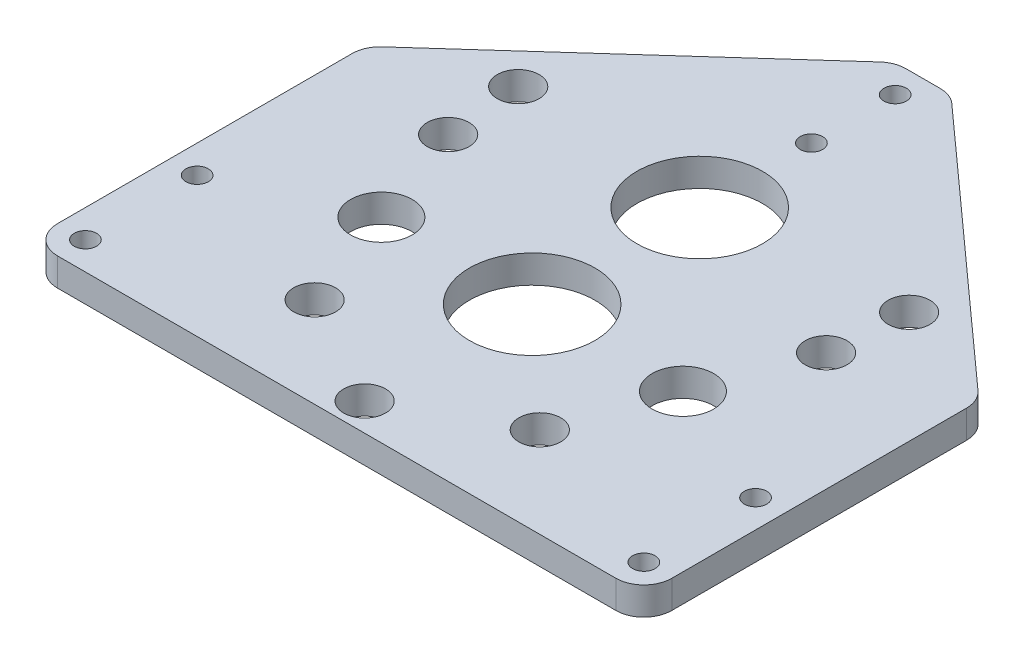
ISO-10303-21;
HEADER;
FILE_DESCRIPTION(('STEP AP214'),'2;1');
FILE_NAME('part.step','',(''),(''),'','','');
FILE_SCHEMA(('AUTOMOTIVE_DESIGN { 1 0 10303 214 1 1 1 1 }'));
ENDSEC;
DATA;
#1=APPLICATION_CONTEXT('core data for automotive mechanical design processes');
#2=APPLICATION_PROTOCOL_DEFINITION('international standard','automotive_design',2000,#1);
#3=PRODUCT_CONTEXT('',#1,'mechanical');
#4=PRODUCT('Part','Part','',(#3));
#5=PRODUCT_RELATED_PRODUCT_CATEGORY('part','',(#4));
#6=PRODUCT_DEFINITION_FORMATION('','',#4);
#7=PRODUCT_DEFINITION_CONTEXT('part definition',#1,'design');
#8=PRODUCT_DEFINITION('design','',#6,#7);
#9=PRODUCT_DEFINITION_SHAPE('','',#8);
#10=(LENGTH_UNIT() NAMED_UNIT(*) SI_UNIT(.MILLI.,.METRE.));
#11=(NAMED_UNIT(*) PLANE_ANGLE_UNIT() SI_UNIT($,.RADIAN.));
#12=(NAMED_UNIT(*) SI_UNIT($,.STERADIAN.) SOLID_ANGLE_UNIT());
#13=UNCERTAINTY_MEASURE_WITH_UNIT(LENGTH_MEASURE(1.E-05),#10,'distance_accuracy_value','');
#14=(GEOMETRIC_REPRESENTATION_CONTEXT(3) GLOBAL_UNCERTAINTY_ASSIGNED_CONTEXT((#13)) GLOBAL_UNIT_ASSIGNED_CONTEXT((#10,
#11,#12)) REPRESENTATION_CONTEXT('',''));
#15=CARTESIAN_POINT('',(0.,0.,0.));
#16=DIRECTION('',(0.,0.,1.));
#17=DIRECTION('',(1.,0.,0.));
#18=AXIS2_PLACEMENT_3D('',#15,#16,#17);
#19=CARTESIAN_POINT('',(-69.85,6.35,-57.15));
#20=DIRECTION('',(1.,0.,0.));
#21=DIRECTION('',(0.,0.,-1.));
#22=AXIS2_PLACEMENT_3D('',#19,#20,#21);
#23=PLANE('',#22);
#24=DIRECTION('',(0.,0.,1.));
#25=VECTOR('',#24,1.);
#26=CARTESIAN_POINT('',(-69.85,6.35,-57.15));
#27=LINE('',#26,#25);
#28=CARTESIAN_POINT('',(-69.85,6.35,-54.3219487301082));
#29=VERTEX_POINT('',#28);
#30=CARTESIAN_POINT('',(-69.85,6.35,12.7));
#31=VERTEX_POINT('',#30);
#32=EDGE_CURVE('E153',#29,#31,#27,.T.);
#33=ORIENTED_EDGE('',*,*,#32,.F.);
#34=DIRECTION('',(0.,-1.,0.));
#35=VECTOR('',#34,1.);
#36=CARTESIAN_POINT('',(-69.85,6.35,-54.3219487301082));
#37=LINE('',#36,#35);
#38=CARTESIAN_POINT('',(-69.85,0.,-54.3219487301082));
#39=VERTEX_POINT('',#38);
#40=EDGE_CURVE('E11',#29,#39,#37,.T.);
#41=ORIENTED_EDGE('',*,*,#40,.T.);
#42=DIRECTION('',(0.,0.,1.));
#43=VECTOR('',#42,1.);
#44=CARTESIAN_POINT('',(-69.85,0.,-57.15));
#45=LINE('',#44,#43);
#46=CARTESIAN_POINT('',(-69.85,0.,12.7));
#47=VERTEX_POINT('',#46);
#48=EDGE_CURVE('E301',#39,#47,#45,.T.);
#49=ORIENTED_EDGE('',*,*,#48,.T.);
#50=DIRECTION('',(0.,-1.,0.));
#51=VECTOR('',#50,1.);
#52=CARTESIAN_POINT('',(-69.85,6.35,12.7));
#53=LINE('',#52,#51);
#54=EDGE_CURVE('E42',#47,#31,#53,.F.);
#55=ORIENTED_EDGE('',*,*,#54,.T.);
#56=EDGE_LOOP('',(#33,#41,#49,#55));
#57=FACE_BOUND('',#56,.T.);
#58=ADVANCED_FACE('F33',(#57),#23,.F.);
#59=CARTESIAN_POINT('',(-69.85,6.35,19.05));
#60=DIRECTION('',(0.,0.,-1.));
#61=DIRECTION('',(-1.,0.,0.));
#62=AXIS2_PLACEMENT_3D('',#59,#60,#61);
#63=PLANE('',#62);
#64=DIRECTION('',(1.,0.,0.));
#65=VECTOR('',#64,1.);
#66=CARTESIAN_POINT('',(-69.85,0.,19.05));
#67=LINE('',#66,#65);
#68=CARTESIAN_POINT('',(-63.5,0.,19.05));
#69=VERTEX_POINT('',#68);
#70=CARTESIAN_POINT('',(63.5,0.,19.05));
#71=VERTEX_POINT('',#70);
#72=EDGE_CURVE('E316',#69,#71,#67,.T.);
#73=ORIENTED_EDGE('',*,*,#72,.T.);
#74=DIRECTION('',(0.,-1.,0.));
#75=VECTOR('',#74,1.);
#76=CARTESIAN_POINT('',(63.5,6.35,19.05));
#77=LINE('',#76,#75);
#78=CARTESIAN_POINT('',(63.5,6.35,19.05));
#79=VERTEX_POINT('',#78);
#80=EDGE_CURVE('E227',#71,#79,#77,.F.);
#81=ORIENTED_EDGE('',*,*,#80,.T.);
#82=DIRECTION('',(1.,0.,0.));
#83=VECTOR('',#82,1.);
#84=CARTESIAN_POINT('',(-69.85,6.35,19.05));
#85=LINE('',#84,#83);
#86=CARTESIAN_POINT('',(-63.5,6.35,19.05));
#87=VERTEX_POINT('',#86);
#88=EDGE_CURVE('E157',#87,#79,#85,.T.);
#89=ORIENTED_EDGE('',*,*,#88,.F.);
#90=DIRECTION('',(0.,-1.,0.));
#91=VECTOR('',#90,1.);
#92=CARTESIAN_POINT('',(-63.5,6.35,19.05));
#93=LINE('',#92,#91);
#94=EDGE_CURVE('E224',#87,#69,#93,.T.);
#95=ORIENTED_EDGE('',*,*,#94,.T.);
#96=EDGE_LOOP('',(#73,#81,#89,#95));
#97=FACE_BOUND('',#96,.T.);
#98=ADVANCED_FACE('F342',(#97),#63,.F.);
#99=CARTESIAN_POINT('',(69.85,6.35,19.05));
#100=DIRECTION('',(-1.,0.,0.));
#101=DIRECTION('',(0.,0.,1.));
#102=AXIS2_PLACEMENT_3D('',#99,#100,#101);
#103=PLANE('',#102);
#104=DIRECTION('',(0.,0.,-1.));
#105=VECTOR('',#104,1.);
#106=CARTESIAN_POINT('',(69.85,0.,19.05));
#107=LINE('',#106,#105);
#108=CARTESIAN_POINT('',(69.85,0.,12.7));
#109=VERTEX_POINT('',#108);
#110=CARTESIAN_POINT('',(69.85,0.,-54.3219487301082));
#111=VERTEX_POINT('',#110);
#112=EDGE_CURVE('E319',#109,#111,#107,.T.);
#113=ORIENTED_EDGE('',*,*,#112,.T.);
#114=DIRECTION('',(0.,-1.,0.));
#115=VECTOR('',#114,1.);
#116=CARTESIAN_POINT('',(69.85,6.35,-54.3219487301082));
#117=LINE('',#116,#115);
#118=CARTESIAN_POINT('',(69.85,6.35,-54.3219487301082));
#119=VERTEX_POINT('',#118);
#120=EDGE_CURVE('E222',#111,#119,#117,.F.);
#121=ORIENTED_EDGE('',*,*,#120,.T.);
#122=DIRECTION('',(0.,0.,-1.));
#123=VECTOR('',#122,1.);
#124=CARTESIAN_POINT('',(69.85,6.35,19.05));
#125=LINE('',#124,#123);
#126=CARTESIAN_POINT('',(69.85,6.35,12.7));
#127=VERTEX_POINT('',#126);
#128=EDGE_CURVE('E306',#127,#119,#125,.T.);
#129=ORIENTED_EDGE('',*,*,#128,.F.);
#130=DIRECTION('',(0.,-1.,0.));
#131=VECTOR('',#130,1.);
#132=CARTESIAN_POINT('',(69.85,6.35,12.7));
#133=LINE('',#132,#131);
#134=EDGE_CURVE('E219',#127,#109,#133,.T.);
#135=ORIENTED_EDGE('',*,*,#134,.T.);
#136=EDGE_LOOP('',(#113,#121,#129,#135));
#137=FACE_BOUND('',#136,.T.);
#138=ADVANCED_FACE('F339',(#137),#103,.F.);
#139=CARTESIAN_POINT('',(69.85,6.35,-57.15));
#140=DIRECTION('',(-0.66896473162245,0.,0.743294146247166));
#141=DIRECTION('',(0.743294146247166,0.,0.66896473162245));
#142=AXIS2_PLACEMENT_3D('',#139,#140,#141);
#143=PLANE('',#142);
#144=DIRECTION('',(-0.743294146247166,0.,-0.66896473162245));
#145=VECTOR('',#144,1.);
#146=CARTESIAN_POINT('',(69.85,0.,-57.15));
#147=LINE('',#146,#145);
#148=CARTESIAN_POINT('',(67.7479260458025,0.,-59.0418665587777));
#149=VERTEX_POINT('',#148);
#150=CARTESIAN_POINT('',(8.16120241258942,0.,-112.669917828669));
#151=VERTEX_POINT('',#150);
#152=EDGE_CURVE('E159',#149,#151,#147,.T.);
#153=ORIENTED_EDGE('',*,*,#152,.T.);
#154=DIRECTION('',(0.,-1.,0.));
#155=VECTOR('',#154,1.);
#156=CARTESIAN_POINT('',(8.16120241258941,6.35,-112.669917828669));
#157=LINE('',#156,#155);
#158=CARTESIAN_POINT('',(8.16120241258942,6.35,-112.669917828669));
#159=VERTEX_POINT('',#158);
#160=EDGE_CURVE('E50',#151,#159,#157,.F.);
#161=ORIENTED_EDGE('',*,*,#160,.T.);
#162=DIRECTION('',(-0.743294146247166,0.,-0.66896473162245));
#163=VECTOR('',#162,1.);
#164=CARTESIAN_POINT('',(69.85,6.35,-57.15));
#165=LINE('',#164,#163);
#166=CARTESIAN_POINT('',(67.7479260458025,6.35,-59.0418665587777));
#167=VERTEX_POINT('',#166);
#168=EDGE_CURVE('E308',#167,#159,#165,.T.);
#169=ORIENTED_EDGE('',*,*,#168,.F.);
#170=DIRECTION('',(0.,-1.,0.));
#171=VECTOR('',#170,1.);
#172=CARTESIAN_POINT('',(67.7479260458025,6.35,-59.0418665587777));
#173=LINE('',#172,#171);
#174=EDGE_CURVE('E215',#167,#149,#173,.T.);
#175=ORIENTED_EDGE('',*,*,#174,.T.);
#176=EDGE_LOOP('',(#153,#161,#169,#175));
#177=FACE_BOUND('',#176,.T.);
#178=ADVANCED_FACE('F322',(#177),#143,.F.);
#179=CARTESIAN_POINT('',(6.34999999999999,6.35,-114.3));
#180=DIRECTION('',(0.,0.,1.));
#181=DIRECTION('',(1.,0.,0.));
#182=AXIS2_PLACEMENT_3D('',#179,#180,#181);
#183=PLANE('',#182);
#184=DIRECTION('',(-1.,0.,0.));
#185=VECTOR('',#184,1.);
#186=CARTESIAN_POINT('',(6.34999999999999,0.,-114.3));
#187=LINE('',#186,#185);
#188=CARTESIAN_POINT('',(3.91327636678685,0.,-114.3));
#189=VERTEX_POINT('',#188);
#190=CARTESIAN_POINT('',(-3.91327636678688,0.,-114.3));
#191=VERTEX_POINT('',#190);
#192=EDGE_CURVE('E154',#189,#191,#187,.T.);
#193=ORIENTED_EDGE('',*,*,#192,.T.);
#194=DIRECTION('',(0.,-1.,0.));
#195=VECTOR('',#194,1.);
#196=CARTESIAN_POINT('',(-3.91327636678688,6.35,-114.3));
#197=LINE('',#196,#195);
#198=CARTESIAN_POINT('',(-3.91327636678688,6.35,-114.3));
#199=VERTEX_POINT('',#198);
#200=EDGE_CURVE('E131',#191,#199,#197,.F.);
#201=ORIENTED_EDGE('',*,*,#200,.T.);
#202=DIRECTION('',(-1.,0.,0.));
#203=VECTOR('',#202,1.);
#204=CARTESIAN_POINT('',(6.34999999999999,6.35,-114.3));
#205=LINE('',#204,#203);
#206=CARTESIAN_POINT('',(3.91327636678685,6.35,-114.3));
#207=VERTEX_POINT('',#206);
#208=EDGE_CURVE('E310',#207,#199,#205,.T.);
#209=ORIENTED_EDGE('',*,*,#208,.F.);
#210=DIRECTION('',(0.,-1.,0.));
#211=VECTOR('',#210,1.);
#212=CARTESIAN_POINT('',(3.91327636678685,6.35,-114.3));
#213=LINE('',#212,#211);
#214=EDGE_CURVE('E136',#207,#189,#213,.T.);
#215=ORIENTED_EDGE('',*,*,#214,.T.);
#216=EDGE_LOOP('',(#193,#201,#209,#215));
#217=FACE_BOUND('',#216,.T.);
#218=ADVANCED_FACE('F331',(#217),#183,.F.);
#219=CARTESIAN_POINT('',(-6.35000000000001,6.35,-114.3));
#220=DIRECTION('',(0.66896473162245,0.,0.743294146247166));
#221=DIRECTION('',(0.743294146247166,0.,-0.66896473162245));
#222=AXIS2_PLACEMENT_3D('',#219,#220,#221);
#223=PLANE('',#222);
#224=DIRECTION('',(-0.743294146247166,0.,0.66896473162245));
#225=VECTOR('',#224,1.);
#226=CARTESIAN_POINT('',(-6.35000000000001,6.35,-114.3));
#227=LINE('',#226,#225);
#228=CARTESIAN_POINT('',(-8.16120241258944,6.35,-112.66991782867));
#229=VERTEX_POINT('',#228);
#230=CARTESIAN_POINT('',(-67.7479260458025,6.35,-59.0418665587777));
#231=VERTEX_POINT('',#230);
#232=EDGE_CURVE('E146',#229,#231,#227,.T.);
#233=ORIENTED_EDGE('',*,*,#232,.F.);
#234=DIRECTION('',(0.,-1.,0.));
#235=VECTOR('',#234,1.);
#236=CARTESIAN_POINT('',(-8.16120241258944,6.35,-112.66991782867));
#237=LINE('',#236,#235);
#238=CARTESIAN_POINT('',(-8.16120241258944,0.,-112.66991782867));
#239=VERTEX_POINT('',#238);
#240=EDGE_CURVE('E130',#229,#239,#237,.T.);
#241=ORIENTED_EDGE('',*,*,#240,.T.);
#242=DIRECTION('',(-0.743294146247166,0.,0.66896473162245));
#243=VECTOR('',#242,1.);
#244=CARTESIAN_POINT('',(-6.35000000000001,0.,-114.3));
#245=LINE('',#244,#243);
#246=CARTESIAN_POINT('',(-67.7479260458025,0.,-59.0418665587777));
#247=VERTEX_POINT('',#246);
#248=EDGE_CURVE('E143',#239,#247,#245,.T.);
#249=ORIENTED_EDGE('',*,*,#248,.T.);
#250=DIRECTION('',(0.,-1.,0.));
#251=VECTOR('',#250,1.);
#252=CARTESIAN_POINT('',(-67.7479260458026,6.35,-59.0418665587777));
#253=LINE('',#252,#251);
#254=EDGE_CURVE('E148',#247,#231,#253,.F.);
#255=ORIENTED_EDGE('',*,*,#254,.T.);
#256=EDGE_LOOP('',(#233,#241,#249,#255));
#257=FACE_BOUND('',#256,.T.);
#258=ADVANCED_FACE('F142',(#257),#223,.F.);
#259=CARTESIAN_POINT('',(0.,6.35,0.));
#260=DIRECTION('',(0.,1.,0.));
#261=DIRECTION('',(0.,0.,1.));
#262=AXIS2_PLACEMENT_3D('',#259,#260,#261);
#263=PLANE('',#262);
#264=CARTESIAN_POINT('',(-44.45,6.35,-66.675));
#265=DIRECTION('',(0.,1.,0.));
#266=DIRECTION('',(0.,0.,1.));
#267=AXIS2_PLACEMENT_3D('',#264,#265,#266);
#268=CIRCLE('',#267,4.76249999999999);
#269=CARTESIAN_POINT('',(-44.45,6.35,-61.9125));
#270=VERTEX_POINT('',#269);
#271=EDGE_CURVE('E232',#270,#270,#268,.T.);
#272=ORIENTED_EDGE('',*,*,#271,.F.);
#273=EDGE_LOOP('',(#272));
#274=FACE_BOUND('',#273,.T.);
#275=CARTESIAN_POINT('',(0.,6.35,12.7));
#276=DIRECTION('',(0.,1.,0.));
#277=DIRECTION('',(0.,0.,1.));
#278=AXIS2_PLACEMENT_3D('',#275,#276,#277);
#279=CIRCLE('',#278,4.7625);
#280=CARTESIAN_POINT('',(0.,6.35,17.4625));
#281=VERTEX_POINT('',#280);
#282=EDGE_CURVE('E235',#281,#281,#279,.T.);
#283=ORIENTED_EDGE('',*,*,#282,.F.);
#284=EDGE_LOOP('',(#283));
#285=FACE_BOUND('',#284,.T.);
#286=CARTESIAN_POINT('',(44.45,6.35,-66.675));
#287=DIRECTION('',(0.,1.,0.));
#288=DIRECTION('',(0.,0.,1.));
#289=AXIS2_PLACEMENT_3D('',#286,#287,#288);
#290=CIRCLE('',#289,4.7625);
#291=CARTESIAN_POINT('',(44.45,6.35,-61.9125));
#292=VERTEX_POINT('',#291);
#293=EDGE_CURVE('E192',#292,#292,#290,.T.);
#294=ORIENTED_EDGE('',*,*,#293,.F.);
#295=EDGE_LOOP('',(#294));
#296=FACE_BOUND('',#295,.T.);
#297=CARTESIAN_POINT('',(-63.4999999999999,6.35,-12.7));
#298=DIRECTION('',(0.,1.,0.));
#299=DIRECTION('',(0.,0.,1.));
#300=AXIS2_PLACEMENT_3D('',#297,#298,#299);
#301=CIRCLE('',#300,2.55269999999998);
#302=CARTESIAN_POINT('',(-63.4999999999999,6.35,-10.1473));
#303=VERTEX_POINT('',#302);
#304=EDGE_CURVE('E188',#303,#303,#301,.T.);
#305=ORIENTED_EDGE('',*,*,#304,.F.);
#306=EDGE_LOOP('',(#305));
#307=FACE_BOUND('',#306,.T.);
#308=CARTESIAN_POINT('',(63.5000000000002,6.35,-12.7));
#309=DIRECTION('',(0.,1.,0.));
#310=DIRECTION('',(0.,0.,1.));
#311=AXIS2_PLACEMENT_3D('',#308,#309,#310);
#312=CIRCLE('',#311,2.55269999999998);
#313=CARTESIAN_POINT('',(63.5000000000002,6.35,-10.1473));
#314=VERTEX_POINT('',#313);
#315=EDGE_CURVE('E184',#314,#314,#312,.T.);
#316=ORIENTED_EDGE('',*,*,#315,.F.);
#317=EDGE_LOOP('',(#316));
#318=FACE_BOUND('',#317,.T.);
#319=CARTESIAN_POINT('',(0.,6.35,-107.95));
#320=DIRECTION('',(0.,1.,0.));
#321=DIRECTION('',(0.,0.,1.));
#322=AXIS2_PLACEMENT_3D('',#319,#320,#321);
#323=CIRCLE('',#322,2.55269999999998);
#324=CARTESIAN_POINT('',(0.,6.35,-105.3973));
#325=VERTEX_POINT('',#324);
#326=EDGE_CURVE('E183',#325,#325,#323,.T.);
#327=ORIENTED_EDGE('',*,*,#326,.F.);
#328=EDGE_LOOP('',(#327));
#329=FACE_BOUND('',#328,.T.);
#330=CARTESIAN_POINT('',(-63.5,6.35,12.7));
#331=DIRECTION('',(0.,1.,0.));
#332=DIRECTION('',(0.,0.,1.));
#333=AXIS2_PLACEMENT_3D('',#330,#331,#332);
#334=CIRCLE('',#333,2.5527);
#335=CARTESIAN_POINT('',(-63.5,6.35,15.2527));
#336=VERTEX_POINT('',#335);
#337=EDGE_CURVE('E254',#336,#336,#334,.T.);
#338=ORIENTED_EDGE('',*,*,#337,.F.);
#339=EDGE_LOOP('',(#338));
#340=FACE_BOUND('',#339,.T.);
#341=CARTESIAN_POINT('',(63.5000000000002,6.35,12.7));
#342=DIRECTION('',(0.,1.,0.));
#343=DIRECTION('',(0.,0.,1.));
#344=AXIS2_PLACEMENT_3D('',#341,#342,#343);
#345=CIRCLE('',#344,2.55270000000001);
#346=CARTESIAN_POINT('',(63.5000000000002,6.35,15.2527));
#347=VERTEX_POINT('',#346);
#348=EDGE_CURVE('E260',#347,#347,#345,.T.);
#349=ORIENTED_EDGE('',*,*,#348,.F.);
#350=EDGE_LOOP('',(#349));
#351=FACE_BOUND('',#350,.T.);
#352=CARTESIAN_POINT('',(0.,6.35,-88.9));
#353=DIRECTION('',(0.,1.,0.));
#354=DIRECTION('',(0.,0.,1.));
#355=AXIS2_PLACEMENT_3D('',#352,#353,#354);
#356=CIRCLE('',#355,2.5527);
#357=CARTESIAN_POINT('',(0.,6.35,-86.3473));
#358=VERTEX_POINT('',#357);
#359=EDGE_CURVE('E266',#358,#358,#356,.T.);
#360=ORIENTED_EDGE('',*,*,#359,.F.);
#361=EDGE_LOOP('',(#360));
#362=FACE_BOUND('',#361,.T.);
#363=CARTESIAN_POINT('',(-25.602688359528,6.35,-1.53180743203793));
#364=DIRECTION('',(0.,1.,0.));
#365=DIRECTION('',(0.,0.,1.));
#366=AXIS2_PLACEMENT_3D('',#363,#364,#365);
#367=CIRCLE('',#366,4.76250000000001);
#368=CARTESIAN_POINT('',(-25.602688359528,6.35,3.23069256796208));
#369=VERTEX_POINT('',#368);
#370=EDGE_CURVE('E167',#369,#369,#367,.T.);
#371=ORIENTED_EDGE('',*,*,#370,.F.);
#372=EDGE_LOOP('',(#371));
#373=FACE_BOUND('',#372,.T.);
#374=CARTESIAN_POINT('',(25.6026883595283,6.35,-1.53180743203786));
#375=DIRECTION('',(0.,1.,0.));
#376=DIRECTION('',(0.,0.,1.));
#377=AXIS2_PLACEMENT_3D('',#374,#375,#376);
#378=CIRCLE('',#377,4.76250000000001);
#379=CARTESIAN_POINT('',(25.6026883595283,6.35,3.23069256796215));
#380=VERTEX_POINT('',#379);
#381=EDGE_CURVE('E176',#380,#380,#378,.T.);
#382=ORIENTED_EDGE('',*,*,#381,.F.);
#383=EDGE_LOOP('',(#382));
#384=FACE_BOUND('',#383,.T.);
#385=CARTESIAN_POINT('',(42.977311640472,6.35,-49.2681925679621));
#386=DIRECTION('',(0.,1.,0.));
#387=DIRECTION('',(0.,0.,1.));
#388=AXIS2_PLACEMENT_3D('',#385,#386,#387);
#389=CIRCLE('',#388,4.76250000000001);
#390=CARTESIAN_POINT('',(42.977311640472,6.35,-44.5056925679621));
#391=VERTEX_POINT('',#390);
#392=EDGE_CURVE('E171',#391,#391,#389,.T.);
#393=ORIENTED_EDGE('',*,*,#392,.F.);
#394=EDGE_LOOP('',(#393));
#395=FACE_BOUND('',#394,.T.);
#396=CARTESIAN_POINT('',(-42.9773116404716,6.35,-49.2681925679622));
#397=DIRECTION('',(0.,1.,0.));
#398=DIRECTION('',(0.,0.,1.));
#399=AXIS2_PLACEMENT_3D('',#396,#397,#398);
#400=CIRCLE('',#399,4.76250000000001);
#401=CARTESIAN_POINT('',(-42.9773116404716,6.35,-44.5056925679622));
#402=VERTEX_POINT('',#401);
#403=EDGE_CURVE('E166',#402,#402,#400,.T.);
#404=ORIENTED_EDGE('',*,*,#403,.F.);
#405=EDGE_LOOP('',(#404));
#406=FACE_BOUND('',#405,.T.);
#407=CARTESIAN_POINT('',(0.,6.35,-63.5));
#408=DIRECTION('',(0.,1.,0.));
#409=DIRECTION('',(0.,0.,1.));
#410=AXIS2_PLACEMENT_3D('',#407,#408,#409);
#411=CIRCLE('',#410,14.2875);
#412=CARTESIAN_POINT('',(0.,6.35,-49.2125));
#413=VERTEX_POINT('',#412);
#414=EDGE_CURVE('E279',#413,#413,#411,.T.);
#415=ORIENTED_EDGE('',*,*,#414,.F.);
#416=EDGE_LOOP('',(#415));
#417=FACE_BOUND('',#416,.T.);
#418=CARTESIAN_POINT('',(0.,6.35,-25.4));
#419=DIRECTION('',(0.,1.,0.));
#420=DIRECTION('',(0.,0.,1.));
#421=AXIS2_PLACEMENT_3D('',#418,#419,#420);
#422=CIRCLE('',#421,14.2875);
#423=CARTESIAN_POINT('',(0.,6.35,-11.1125));
#424=VERTEX_POINT('',#423);
#425=EDGE_CURVE('E283',#424,#424,#422,.T.);
#426=ORIENTED_EDGE('',*,*,#425,.F.);
#427=EDGE_LOOP('',(#426));
#428=FACE_BOUND('',#427,.T.);
#429=CARTESIAN_POINT('',(34.29,6.35,-25.4));
#430=DIRECTION('',(0.,1.,0.));
#431=DIRECTION('',(0.,0.,1.));
#432=AXIS2_PLACEMENT_3D('',#429,#430,#431);
#433=CIRCLE('',#432,7.);
#434=CARTESIAN_POINT('',(34.29,6.35,-18.4));
#435=VERTEX_POINT('',#434);
#436=EDGE_CURVE('E289',#435,#435,#433,.T.);
#437=ORIENTED_EDGE('',*,*,#436,.F.);
#438=EDGE_LOOP('',(#437));
#439=FACE_BOUND('',#438,.T.);
#440=CARTESIAN_POINT('',(-34.29,6.35,-25.4));
#441=DIRECTION('',(0.,1.,0.));
#442=DIRECTION('',(0.,0.,1.));
#443=AXIS2_PLACEMENT_3D('',#440,#441,#442);
#444=CIRCLE('',#443,7.);
#445=CARTESIAN_POINT('',(-34.29,6.35,-18.4));
#446=VERTEX_POINT('',#445);
#447=EDGE_CURVE('E295',#446,#446,#444,.T.);
#448=ORIENTED_EDGE('',*,*,#447,.F.);
#449=EDGE_LOOP('',(#448));
#450=FACE_BOUND('',#449,.T.);
#451=ORIENTED_EDGE('',*,*,#208,.T.);
#452=CARTESIAN_POINT('',(-3.91327636678688,6.35,-107.95));
#453=DIRECTION('',(0.,1.,0.));
#454=DIRECTION('',(0.,0.,1.));
#455=AXIS2_PLACEMENT_3D('',#452,#453,#454);
#456=CIRCLE('',#455,6.35);
#457=EDGE_CURVE('E213',#199,#229,#456,.T.);
#458=ORIENTED_EDGE('',*,*,#457,.T.);
#459=ORIENTED_EDGE('',*,*,#232,.T.);
#460=CARTESIAN_POINT('',(-63.5,6.35,-54.3219487301082));
#461=DIRECTION('',(0.,1.,0.));
#462=DIRECTION('',(0.,0.,1.));
#463=AXIS2_PLACEMENT_3D('',#460,#461,#462);
#464=CIRCLE('',#463,6.35);
#465=EDGE_CURVE('E206',#231,#29,#464,.T.);
#466=ORIENTED_EDGE('',*,*,#465,.T.);
#467=ORIENTED_EDGE('',*,*,#32,.T.);
#468=CARTESIAN_POINT('',(-63.5,6.35,12.7));
#469=DIRECTION('',(0.,1.,0.));
#470=DIRECTION('',(0.,0.,1.));
#471=AXIS2_PLACEMENT_3D('',#468,#469,#470);
#472=CIRCLE('',#471,6.35);
#473=EDGE_CURVE('E204',#31,#87,#472,.T.);
#474=ORIENTED_EDGE('',*,*,#473,.T.);
#475=ORIENTED_EDGE('',*,*,#88,.T.);
#476=CARTESIAN_POINT('',(63.5,6.35,12.7));
#477=DIRECTION('',(0.,1.,0.));
#478=DIRECTION('',(0.,0.,1.));
#479=AXIS2_PLACEMENT_3D('',#476,#477,#478);
#480=CIRCLE('',#479,6.35);
#481=EDGE_CURVE('E208',#79,#127,#480,.T.);
#482=ORIENTED_EDGE('',*,*,#481,.T.);
#483=ORIENTED_EDGE('',*,*,#128,.T.);
#484=CARTESIAN_POINT('',(63.5,6.35,-54.3219487301082));
#485=DIRECTION('',(0.,1.,0.));
#486=DIRECTION('',(0.,0.,1.));
#487=AXIS2_PLACEMENT_3D('',#484,#485,#486);
#488=CIRCLE('',#487,6.35);
#489=EDGE_CURVE('E57',#119,#167,#488,.T.);
#490=ORIENTED_EDGE('',*,*,#489,.T.);
#491=ORIENTED_EDGE('',*,*,#168,.T.);
#492=CARTESIAN_POINT('',(3.91327636678685,6.35,-107.95));
#493=DIRECTION('',(0.,1.,0.));
#494=DIRECTION('',(0.,0.,1.));
#495=AXIS2_PLACEMENT_3D('',#492,#493,#494);
#496=CIRCLE('',#495,6.35);
#497=EDGE_CURVE('E211',#159,#207,#496,.T.);
#498=ORIENTED_EDGE('',*,*,#497,.T.);
#499=EDGE_LOOP('',(#451,#458,#459,#466,#467,#474,#475,#482,#483,#490,#491,#498));
#500=FACE_BOUND('',#499,.T.);
#501=ADVANCED_FACE('F329',(#274,#285,#296,#307,#318,#329,#340,#351,#362,#373,#384,#395,#406,
#417,#428,#439,#450,#500),#263,.T.);
#502=CARTESIAN_POINT('',(0.,0.,0.));
#503=DIRECTION('',(0.,1.,0.));
#504=DIRECTION('',(0.,0.,1.));
#505=AXIS2_PLACEMENT_3D('',#502,#503,#504);
#506=PLANE('',#505);
#507=CARTESIAN_POINT('',(-44.45,0.,-66.675));
#508=DIRECTION('',(0.,1.,0.));
#509=DIRECTION('',(0.,0.,1.));
#510=AXIS2_PLACEMENT_3D('',#507,#508,#509);
#511=CIRCLE('',#510,4.76249999999999);
#512=CARTESIAN_POINT('',(-44.45,0.,-61.9125));
#513=VERTEX_POINT('',#512);
#514=EDGE_CURVE('E37',#513,#513,#511,.T.);
#515=ORIENTED_EDGE('',*,*,#514,.T.);
#516=EDGE_LOOP('',(#515));
#517=FACE_BOUND('',#516,.T.);
#518=CARTESIAN_POINT('',(0.,0.,12.7));
#519=DIRECTION('',(0.,1.,0.));
#520=DIRECTION('',(0.,0.,1.));
#521=AXIS2_PLACEMENT_3D('',#518,#519,#520);
#522=CIRCLE('',#521,4.7625);
#523=CARTESIAN_POINT('',(0.,0.,17.4625));
#524=VERTEX_POINT('',#523);
#525=EDGE_CURVE('E233',#524,#524,#522,.T.);
#526=ORIENTED_EDGE('',*,*,#525,.T.);
#527=EDGE_LOOP('',(#526));
#528=FACE_BOUND('',#527,.T.);
#529=CARTESIAN_POINT('',(44.45,0.,-66.675));
#530=DIRECTION('',(0.,1.,0.));
#531=DIRECTION('',(0.,0.,1.));
#532=AXIS2_PLACEMENT_3D('',#529,#530,#531);
#533=CIRCLE('',#532,4.7625);
#534=CARTESIAN_POINT('',(44.45,0.,-61.9125));
#535=VERTEX_POINT('',#534);
#536=EDGE_CURVE('E230',#535,#535,#533,.T.);
#537=ORIENTED_EDGE('',*,*,#536,.T.);
#538=EDGE_LOOP('',(#537));
#539=FACE_BOUND('',#538,.T.);
#540=CARTESIAN_POINT('',(-63.4999999999999,0.,-12.7));
#541=DIRECTION('',(0.,1.,0.));
#542=DIRECTION('',(0.,0.,1.));
#543=AXIS2_PLACEMENT_3D('',#540,#541,#542);
#544=CIRCLE('',#543,2.55269999999998);
#545=CARTESIAN_POINT('',(-63.4999999999999,0.,-10.1473));
#546=VERTEX_POINT('',#545);
#547=EDGE_CURVE('E189',#546,#546,#544,.T.);
#548=ORIENTED_EDGE('',*,*,#547,.T.);
#549=EDGE_LOOP('',(#548));
#550=FACE_BOUND('',#549,.T.);
#551=CARTESIAN_POINT('',(63.5000000000002,0.,-12.7));
#552=DIRECTION('',(0.,1.,0.));
#553=DIRECTION('',(0.,0.,1.));
#554=AXIS2_PLACEMENT_3D('',#551,#552,#553);
#555=CIRCLE('',#554,2.55269999999998);
#556=CARTESIAN_POINT('',(63.5000000000002,0.,-10.1473));
#557=VERTEX_POINT('',#556);
#558=EDGE_CURVE('E185',#557,#557,#555,.T.);
#559=ORIENTED_EDGE('',*,*,#558,.T.);
#560=EDGE_LOOP('',(#559));
#561=FACE_BOUND('',#560,.T.);
#562=CARTESIAN_POINT('',(0.,0.,-107.95));
#563=DIRECTION('',(0.,1.,0.));
#564=DIRECTION('',(0.,0.,1.));
#565=AXIS2_PLACEMENT_3D('',#562,#563,#564);
#566=CIRCLE('',#565,2.55269999999998);
#567=CARTESIAN_POINT('',(0.,0.,-105.3973));
#568=VERTEX_POINT('',#567);
#569=EDGE_CURVE('E180',#568,#568,#566,.T.);
#570=ORIENTED_EDGE('',*,*,#569,.T.);
#571=EDGE_LOOP('',(#570));
#572=FACE_BOUND('',#571,.T.);
#573=CARTESIAN_POINT('',(-63.5,0.,12.7));
#574=DIRECTION('',(0.,1.,0.));
#575=DIRECTION('',(0.,0.,1.));
#576=AXIS2_PLACEMENT_3D('',#573,#574,#575);
#577=CIRCLE('',#576,2.55269999999998);
#578=CARTESIAN_POINT('',(-63.5,0.,15.2527));
#579=VERTEX_POINT('',#578);
#580=EDGE_CURVE('E257',#579,#579,#577,.T.);
#581=ORIENTED_EDGE('',*,*,#580,.T.);
#582=EDGE_LOOP('',(#581));
#583=FACE_BOUND('',#582,.T.);
#584=CARTESIAN_POINT('',(63.5000000000002,0.,12.7));
#585=DIRECTION('',(0.,1.,0.));
#586=DIRECTION('',(0.,0.,1.));
#587=AXIS2_PLACEMENT_3D('',#584,#585,#586);
#588=CIRCLE('',#587,2.55269999999998);
#589=CARTESIAN_POINT('',(63.5000000000002,0.,15.2527));
#590=VERTEX_POINT('',#589);
#591=EDGE_CURVE('E263',#590,#590,#588,.T.);
#592=ORIENTED_EDGE('',*,*,#591,.T.);
#593=EDGE_LOOP('',(#592));
#594=FACE_BOUND('',#593,.T.);
#595=CARTESIAN_POINT('',(0.,0.,-88.9));
#596=DIRECTION('',(0.,1.,0.));
#597=DIRECTION('',(0.,0.,1.));
#598=AXIS2_PLACEMENT_3D('',#595,#596,#597);
#599=CIRCLE('',#598,2.55269999999998);
#600=CARTESIAN_POINT('',(0.,0.,-86.3473));
#601=VERTEX_POINT('',#600);
#602=EDGE_CURVE('E172',#601,#601,#599,.T.);
#603=ORIENTED_EDGE('',*,*,#602,.T.);
#604=EDGE_LOOP('',(#603));
#605=FACE_BOUND('',#604,.T.);
#606=CARTESIAN_POINT('',(-25.602688359528,0.,-1.53180743203793));
#607=DIRECTION('',(0.,1.,0.));
#608=DIRECTION('',(0.,0.,1.));
#609=AXIS2_PLACEMENT_3D('',#606,#607,#608);
#610=CIRCLE('',#609,4.76250000000001);
#611=CARTESIAN_POINT('',(-25.602688359528,0.,3.23069256796208));
#612=VERTEX_POINT('',#611);
#613=EDGE_CURVE('E177',#612,#612,#610,.T.);
#614=ORIENTED_EDGE('',*,*,#613,.T.);
#615=EDGE_LOOP('',(#614));
#616=FACE_BOUND('',#615,.T.);
#617=CARTESIAN_POINT('',(25.6026883595283,0.,-1.53180743203786));
#618=DIRECTION('',(0.,1.,0.));
#619=DIRECTION('',(0.,0.,1.));
#620=AXIS2_PLACEMENT_3D('',#617,#618,#619);
#621=CIRCLE('',#620,4.76250000000001);
#622=CARTESIAN_POINT('',(25.6026883595283,0.,3.23069256796215));
#623=VERTEX_POINT('',#622);
#624=EDGE_CURVE('E173',#623,#623,#621,.T.);
#625=ORIENTED_EDGE('',*,*,#624,.T.);
#626=EDGE_LOOP('',(#625));
#627=FACE_BOUND('',#626,.T.);
#628=CARTESIAN_POINT('',(42.977311640472,0.,-49.2681925679621));
#629=DIRECTION('',(0.,1.,0.));
#630=DIRECTION('',(0.,0.,1.));
#631=AXIS2_PLACEMENT_3D('',#628,#629,#630);
#632=CIRCLE('',#631,4.76250000000001);
#633=CARTESIAN_POINT('',(42.977311640472,0.,-44.5056925679621));
#634=VERTEX_POINT('',#633);
#635=EDGE_CURVE('E168',#634,#634,#632,.T.);
#636=ORIENTED_EDGE('',*,*,#635,.T.);
#637=EDGE_LOOP('',(#636));
#638=FACE_BOUND('',#637,.T.);
#639=CARTESIAN_POINT('',(-42.9773116404716,0.,-49.2681925679622));
#640=DIRECTION('',(0.,1.,0.));
#641=DIRECTION('',(0.,0.,1.));
#642=AXIS2_PLACEMENT_3D('',#639,#640,#641);
#643=CIRCLE('',#642,4.76250000000001);
#644=CARTESIAN_POINT('',(-42.9773116404716,0.,-44.5056925679622));
#645=VERTEX_POINT('',#644);
#646=EDGE_CURVE('E163',#645,#645,#643,.T.);
#647=ORIENTED_EDGE('',*,*,#646,.T.);
#648=EDGE_LOOP('',(#647));
#649=FACE_BOUND('',#648,.T.);
#650=CARTESIAN_POINT('',(0.,0.,-63.5));
#651=DIRECTION('',(0.,1.,0.));
#652=DIRECTION('',(0.,0.,1.));
#653=AXIS2_PLACEMENT_3D('',#650,#651,#652);
#654=CIRCLE('',#653,14.2875);
#655=CARTESIAN_POINT('',(0.,0.,-49.2125));
#656=VERTEX_POINT('',#655);
#657=EDGE_CURVE('E280',#656,#656,#654,.T.);
#658=ORIENTED_EDGE('',*,*,#657,.T.);
#659=EDGE_LOOP('',(#658));
#660=FACE_BOUND('',#659,.T.);
#661=CARTESIAN_POINT('',(0.,0.,-25.4));
#662=DIRECTION('',(0.,1.,0.));
#663=DIRECTION('',(0.,0.,1.));
#664=AXIS2_PLACEMENT_3D('',#661,#662,#663);
#665=CIRCLE('',#664,14.2875);
#666=CARTESIAN_POINT('',(0.,0.,-11.1125));
#667=VERTEX_POINT('',#666);
#668=EDGE_CURVE('E286',#667,#667,#665,.T.);
#669=ORIENTED_EDGE('',*,*,#668,.T.);
#670=EDGE_LOOP('',(#669));
#671=FACE_BOUND('',#670,.T.);
#672=CARTESIAN_POINT('',(34.29,0.,-25.4));
#673=DIRECTION('',(0.,1.,0.));
#674=DIRECTION('',(0.,0.,1.));
#675=AXIS2_PLACEMENT_3D('',#672,#673,#674);
#676=CIRCLE('',#675,7.);
#677=CARTESIAN_POINT('',(34.29,0.,-18.4));
#678=VERTEX_POINT('',#677);
#679=EDGE_CURVE('E292',#678,#678,#676,.T.);
#680=ORIENTED_EDGE('',*,*,#679,.T.);
#681=EDGE_LOOP('',(#680));
#682=FACE_BOUND('',#681,.T.);
#683=CARTESIAN_POINT('',(-34.29,0.,-25.4));
#684=DIRECTION('',(0.,1.,0.));
#685=DIRECTION('',(0.,0.,1.));
#686=AXIS2_PLACEMENT_3D('',#683,#684,#685);
#687=CIRCLE('',#686,7.);
#688=CARTESIAN_POINT('',(-34.29,0.,-18.4));
#689=VERTEX_POINT('',#688);
#690=EDGE_CURVE('E298',#689,#689,#687,.T.);
#691=ORIENTED_EDGE('',*,*,#690,.T.);
#692=EDGE_LOOP('',(#691));
#693=FACE_BOUND('',#692,.T.);
#694=ORIENTED_EDGE('',*,*,#248,.F.);
#695=CARTESIAN_POINT('',(-3.91327636678688,0.,-107.95));
#696=DIRECTION('',(0.,1.,0.));
#697=DIRECTION('',(0.,0.,1.));
#698=AXIS2_PLACEMENT_3D('',#695,#696,#697);
#699=CIRCLE('',#698,6.35);
#700=EDGE_CURVE('E126',#239,#191,#699,.F.);
#701=ORIENTED_EDGE('',*,*,#700,.T.);
#702=ORIENTED_EDGE('',*,*,#192,.F.);
#703=CARTESIAN_POINT('',(3.91327636678685,0.,-107.95));
#704=DIRECTION('',(0.,1.,0.));
#705=DIRECTION('',(0.,0.,1.));
#706=AXIS2_PLACEMENT_3D('',#703,#704,#705);
#707=CIRCLE('',#706,6.35);
#708=EDGE_CURVE('E137',#189,#151,#707,.F.);
#709=ORIENTED_EDGE('',*,*,#708,.T.);
#710=ORIENTED_EDGE('',*,*,#152,.F.);
#711=CARTESIAN_POINT('',(63.5,0.,-54.3219487301082));
#712=DIRECTION('',(0.,1.,0.));
#713=DIRECTION('',(0.,0.,1.));
#714=AXIS2_PLACEMENT_3D('',#711,#712,#713);
#715=CIRCLE('',#714,6.35);
#716=EDGE_CURVE('E198',#149,#111,#715,.F.);
#717=ORIENTED_EDGE('',*,*,#716,.T.);
#718=ORIENTED_EDGE('',*,*,#112,.F.);
#719=CARTESIAN_POINT('',(63.5,0.,12.7));
#720=DIRECTION('',(0.,1.,0.));
#721=DIRECTION('',(0.,0.,1.));
#722=AXIS2_PLACEMENT_3D('',#719,#720,#721);
#723=CIRCLE('',#722,6.35);
#724=EDGE_CURVE('E196',#109,#71,#723,.F.);
#725=ORIENTED_EDGE('',*,*,#724,.T.);
#726=ORIENTED_EDGE('',*,*,#72,.F.);
#727=CARTESIAN_POINT('',(-63.5,0.,12.7));
#728=DIRECTION('',(0.,1.,0.));
#729=DIRECTION('',(0.,0.,1.));
#730=AXIS2_PLACEMENT_3D('',#727,#728,#729);
#731=CIRCLE('',#730,6.35);
#732=EDGE_CURVE('E147',#69,#47,#731,.F.);
#733=ORIENTED_EDGE('',*,*,#732,.T.);
#734=ORIENTED_EDGE('',*,*,#48,.F.);
#735=CARTESIAN_POINT('',(-63.5,0.,-54.3219487301082));
#736=DIRECTION('',(0.,1.,0.));
#737=DIRECTION('',(0.,0.,1.));
#738=AXIS2_PLACEMENT_3D('',#735,#736,#737);
#739=CIRCLE('',#738,6.35);
#740=EDGE_CURVE('E152',#39,#247,#739,.F.);
#741=ORIENTED_EDGE('',*,*,#740,.T.);
#742=EDGE_LOOP('',(#694,#701,#702,#709,#710,#717,#718,#725,#726,#733,#734,#741));
#743=FACE_BOUND('',#742,.T.);
#744=ADVANCED_FACE('F150',(#517,#528,#539,#550,#561,#572,#583,#594,#605,#616,#627,#638,#649,
#660,#671,#682,#693,#743),#506,.F.);
#745=CARTESIAN_POINT('',(-34.29,0.,-25.4));
#746=DIRECTION('',(0.,1.,0.));
#747=DIRECTION('',(0.,0.,1.));
#748=AXIS2_PLACEMENT_3D('',#745,#746,#747);
#749=CYLINDRICAL_SURFACE('',#748,7.);
#750=ORIENTED_EDGE('',*,*,#690,.F.);
#751=EDGE_LOOP('',(#750));
#752=FACE_BOUND('',#751,.T.);
#753=ORIENTED_EDGE('',*,*,#447,.T.);
#754=EDGE_LOOP('',(#753));
#755=FACE_BOUND('',#754,.T.);
#756=ADVANCED_FACE('F462',(#752,#755),#749,.F.);
#757=CARTESIAN_POINT('',(34.29,0.,-25.4));
#758=DIRECTION('',(0.,1.,0.));
#759=DIRECTION('',(0.,0.,1.));
#760=AXIS2_PLACEMENT_3D('',#757,#758,#759);
#761=CYLINDRICAL_SURFACE('',#760,7.);
#762=ORIENTED_EDGE('',*,*,#679,.F.);
#763=EDGE_LOOP('',(#762));
#764=FACE_BOUND('',#763,.T.);
#765=ORIENTED_EDGE('',*,*,#436,.T.);
#766=EDGE_LOOP('',(#765));
#767=FACE_BOUND('',#766,.T.);
#768=ADVANCED_FACE('F542',(#764,#767),#761,.F.);
#769=CARTESIAN_POINT('',(0.,0.,-25.4));
#770=DIRECTION('',(0.,1.,0.));
#771=DIRECTION('',(0.,0.,1.));
#772=AXIS2_PLACEMENT_3D('',#769,#770,#771);
#773=CYLINDRICAL_SURFACE('',#772,14.2875);
#774=ORIENTED_EDGE('',*,*,#668,.F.);
#775=EDGE_LOOP('',(#774));
#776=FACE_BOUND('',#775,.T.);
#777=ORIENTED_EDGE('',*,*,#425,.T.);
#778=EDGE_LOOP('',(#777));
#779=FACE_BOUND('',#778,.T.);
#780=ADVANCED_FACE('F538',(#776,#779),#773,.F.);
#781=CARTESIAN_POINT('',(0.,0.,-63.5));
#782=DIRECTION('',(0.,1.,0.));
#783=DIRECTION('',(0.,0.,1.));
#784=AXIS2_PLACEMENT_3D('',#781,#782,#783);
#785=CYLINDRICAL_SURFACE('',#784,14.2875);
#786=ORIENTED_EDGE('',*,*,#657,.F.);
#787=EDGE_LOOP('',(#786));
#788=FACE_BOUND('',#787,.T.);
#789=ORIENTED_EDGE('',*,*,#414,.T.);
#790=EDGE_LOOP('',(#789));
#791=FACE_BOUND('',#790,.T.);
#792=ADVANCED_FACE('F534',(#788,#791),#785,.F.);
#793=CARTESIAN_POINT('',(-42.9773116404716,-12.7,-49.2681925679622));
#794=DIRECTION('',(0.,1.,0.));
#795=DIRECTION('',(0.,0.,1.));
#796=AXIS2_PLACEMENT_3D('',#793,#794,#795);
#797=CYLINDRICAL_SURFACE('',#796,4.76250000000001);
#798=ORIENTED_EDGE('',*,*,#403,.T.);
#799=EDGE_LOOP('',(#798));
#800=FACE_BOUND('',#799,.T.);
#801=ORIENTED_EDGE('',*,*,#646,.F.);
#802=EDGE_LOOP('',(#801));
#803=FACE_BOUND('',#802,.T.);
#804=ADVANCED_FACE('F530',(#800,#803),#797,.F.);
#805=CARTESIAN_POINT('',(42.977311640472,-12.7,-49.2681925679621));
#806=DIRECTION('',(0.,1.,0.));
#807=DIRECTION('',(0.,0.,1.));
#808=AXIS2_PLACEMENT_3D('',#805,#806,#807);
#809=CYLINDRICAL_SURFACE('',#808,4.76250000000001);
#810=ORIENTED_EDGE('',*,*,#392,.T.);
#811=EDGE_LOOP('',(#810));
#812=FACE_BOUND('',#811,.T.);
#813=ORIENTED_EDGE('',*,*,#635,.F.);
#814=EDGE_LOOP('',(#813));
#815=FACE_BOUND('',#814,.T.);
#816=ADVANCED_FACE('F526',(#812,#815),#809,.F.);
#817=CARTESIAN_POINT('',(25.6026883595283,-12.7,-1.53180743203786));
#818=DIRECTION('',(0.,1.,0.));
#819=DIRECTION('',(0.,0.,1.));
#820=AXIS2_PLACEMENT_3D('',#817,#818,#819);
#821=CYLINDRICAL_SURFACE('',#820,4.76250000000001);
#822=ORIENTED_EDGE('',*,*,#381,.T.);
#823=EDGE_LOOP('',(#822));
#824=FACE_BOUND('',#823,.T.);
#825=ORIENTED_EDGE('',*,*,#624,.F.);
#826=EDGE_LOOP('',(#825));
#827=FACE_BOUND('',#826,.T.);
#828=ADVANCED_FACE('F522',(#824,#827),#821,.F.);
#829=CARTESIAN_POINT('',(-25.602688359528,-12.7,-1.53180743203793));
#830=DIRECTION('',(0.,1.,0.));
#831=DIRECTION('',(0.,0.,1.));
#832=AXIS2_PLACEMENT_3D('',#829,#830,#831);
#833=CYLINDRICAL_SURFACE('',#832,4.76250000000001);
#834=ORIENTED_EDGE('',*,*,#370,.T.);
#835=EDGE_LOOP('',(#834));
#836=FACE_BOUND('',#835,.T.);
#837=ORIENTED_EDGE('',*,*,#613,.F.);
#838=EDGE_LOOP('',(#837));
#839=FACE_BOUND('',#838,.T.);
#840=ADVANCED_FACE('F518',(#836,#839),#833,.F.);
#841=CARTESIAN_POINT('',(0.,6.35,-88.9));
#842=DIRECTION('',(0.,1.,0.));
#843=DIRECTION('',(0.,0.,1.));
#844=AXIS2_PLACEMENT_3D('',#841,#842,#843);
#845=CYLINDRICAL_SURFACE('',#844,2.55269999999999);
#846=ORIENTED_EDGE('',*,*,#602,.F.);
#847=EDGE_LOOP('',(#846));
#848=FACE_BOUND('',#847,.T.);
#849=ORIENTED_EDGE('',*,*,#359,.T.);
#850=EDGE_LOOP('',(#849));
#851=FACE_BOUND('',#850,.T.);
#852=ADVANCED_FACE('F514',(#848,#851),#845,.F.);
#853=CARTESIAN_POINT('',(63.5000000000002,6.35,12.7));
#854=DIRECTION('',(0.,1.,0.));
#855=DIRECTION('',(0.,0.,1.));
#856=AXIS2_PLACEMENT_3D('',#853,#854,#855);
#857=CYLINDRICAL_SURFACE('',#856,2.55269999999999);
#858=ORIENTED_EDGE('',*,*,#591,.F.);
#859=EDGE_LOOP('',(#858));
#860=FACE_BOUND('',#859,.T.);
#861=ORIENTED_EDGE('',*,*,#348,.T.);
#862=EDGE_LOOP('',(#861));
#863=FACE_BOUND('',#862,.T.);
#864=ADVANCED_FACE('F510',(#860,#863),#857,.F.);
#865=CARTESIAN_POINT('',(-63.5,6.35,12.7));
#866=DIRECTION('',(0.,1.,0.));
#867=DIRECTION('',(0.,0.,1.));
#868=AXIS2_PLACEMENT_3D('',#865,#866,#867);
#869=CYLINDRICAL_SURFACE('',#868,2.55269999999999);
#870=ORIENTED_EDGE('',*,*,#580,.F.);
#871=EDGE_LOOP('',(#870));
#872=FACE_BOUND('',#871,.T.);
#873=ORIENTED_EDGE('',*,*,#337,.T.);
#874=EDGE_LOOP('',(#873));
#875=FACE_BOUND('',#874,.T.);
#876=ADVANCED_FACE('F506',(#872,#875),#869,.F.);
#877=CARTESIAN_POINT('',(0.,38.1,-107.95));
#878=DIRECTION('',(0.,1.,0.));
#879=DIRECTION('',(0.,0.,1.));
#880=AXIS2_PLACEMENT_3D('',#877,#878,#879);
#881=CYLINDRICAL_SURFACE('',#880,2.55269999999998);
#882=ORIENTED_EDGE('',*,*,#326,.T.);
#883=EDGE_LOOP('',(#882));
#884=FACE_BOUND('',#883,.T.);
#885=ORIENTED_EDGE('',*,*,#569,.F.);
#886=EDGE_LOOP('',(#885));
#887=FACE_BOUND('',#886,.T.);
#888=ADVANCED_FACE('F502',(#884,#887),#881,.F.);
#889=CARTESIAN_POINT('',(63.5000000000002,38.1,-12.7));
#890=DIRECTION('',(0.,1.,0.));
#891=DIRECTION('',(0.,0.,1.));
#892=AXIS2_PLACEMENT_3D('',#889,#890,#891);
#893=CYLINDRICAL_SURFACE('',#892,2.55269999999998);
#894=ORIENTED_EDGE('',*,*,#315,.T.);
#895=EDGE_LOOP('',(#894));
#896=FACE_BOUND('',#895,.T.);
#897=ORIENTED_EDGE('',*,*,#558,.F.);
#898=EDGE_LOOP('',(#897));
#899=FACE_BOUND('',#898,.T.);
#900=ADVANCED_FACE('F498',(#896,#899),#893,.F.);
#901=CARTESIAN_POINT('',(-63.4999999999999,38.1,-12.7));
#902=DIRECTION('',(0.,1.,0.));
#903=DIRECTION('',(0.,0.,1.));
#904=AXIS2_PLACEMENT_3D('',#901,#902,#903);
#905=CYLINDRICAL_SURFACE('',#904,2.55269999999998);
#906=ORIENTED_EDGE('',*,*,#304,.T.);
#907=EDGE_LOOP('',(#906));
#908=FACE_BOUND('',#907,.T.);
#909=ORIENTED_EDGE('',*,*,#547,.F.);
#910=EDGE_LOOP('',(#909));
#911=FACE_BOUND('',#910,.T.);
#912=ADVANCED_FACE('F355',(#908,#911),#905,.F.);
#913=CARTESIAN_POINT('',(-3.91327636678688,6.35,-107.95));
#914=DIRECTION('',(0.,-1.,0.));
#915=DIRECTION('',(0.,0.,-1.));
#916=AXIS2_PLACEMENT_3D('',#913,#914,#915);
#917=CYLINDRICAL_SURFACE('',#916,6.35);
#918=ORIENTED_EDGE('',*,*,#457,.F.);
#919=ORIENTED_EDGE('',*,*,#200,.F.);
#920=ORIENTED_EDGE('',*,*,#700,.F.);
#921=ORIENTED_EDGE('',*,*,#240,.F.);
#922=EDGE_LOOP('',(#918,#919,#920,#921));
#923=FACE_BOUND('',#922,.T.);
#924=ADVANCED_FACE('F129',(#923),#917,.T.);
#925=CARTESIAN_POINT('',(3.91327636678685,6.35,-107.95));
#926=DIRECTION('',(0.,-1.,0.));
#927=DIRECTION('',(0.,0.,-1.));
#928=AXIS2_PLACEMENT_3D('',#925,#926,#927);
#929=CYLINDRICAL_SURFACE('',#928,6.35);
#930=ORIENTED_EDGE('',*,*,#497,.F.);
#931=ORIENTED_EDGE('',*,*,#160,.F.);
#932=ORIENTED_EDGE('',*,*,#708,.F.);
#933=ORIENTED_EDGE('',*,*,#214,.F.);
#934=EDGE_LOOP('',(#930,#931,#932,#933));
#935=FACE_BOUND('',#934,.T.);
#936=ADVANCED_FACE('F326',(#935),#929,.T.);
#937=CARTESIAN_POINT('',(63.5,6.35,-54.3219487301082));
#938=DIRECTION('',(0.,-1.,0.));
#939=DIRECTION('',(0.,0.,-1.));
#940=AXIS2_PLACEMENT_3D('',#937,#938,#939);
#941=CYLINDRICAL_SURFACE('',#940,6.35);
#942=ORIENTED_EDGE('',*,*,#489,.F.);
#943=ORIENTED_EDGE('',*,*,#120,.F.);
#944=ORIENTED_EDGE('',*,*,#716,.F.);
#945=ORIENTED_EDGE('',*,*,#174,.F.);
#946=EDGE_LOOP('',(#942,#943,#944,#945));
#947=FACE_BOUND('',#946,.T.);
#948=ADVANCED_FACE('F358',(#947),#941,.T.);
#949=CARTESIAN_POINT('',(63.5,6.35,12.7));
#950=DIRECTION('',(0.,-1.,0.));
#951=DIRECTION('',(0.,0.,-1.));
#952=AXIS2_PLACEMENT_3D('',#949,#950,#951);
#953=CYLINDRICAL_SURFACE('',#952,6.35);
#954=ORIENTED_EDGE('',*,*,#481,.F.);
#955=ORIENTED_EDGE('',*,*,#80,.F.);
#956=ORIENTED_EDGE('',*,*,#724,.F.);
#957=ORIENTED_EDGE('',*,*,#134,.F.);
#958=EDGE_LOOP('',(#954,#955,#956,#957));
#959=FACE_BOUND('',#958,.T.);
#960=ADVANCED_FACE('F361',(#959),#953,.T.);
#961=CARTESIAN_POINT('',(-63.5,6.35,-54.3219487301082));
#962=DIRECTION('',(0.,-1.,0.));
#963=DIRECTION('',(0.,0.,-1.));
#964=AXIS2_PLACEMENT_3D('',#961,#962,#963);
#965=CYLINDRICAL_SURFACE('',#964,6.35);
#966=ORIENTED_EDGE('',*,*,#465,.F.);
#967=ORIENTED_EDGE('',*,*,#254,.F.);
#968=ORIENTED_EDGE('',*,*,#740,.F.);
#969=ORIENTED_EDGE('',*,*,#40,.F.);
#970=EDGE_LOOP('',(#966,#967,#968,#969));
#971=FACE_BOUND('',#970,.T.);
#972=ADVANCED_FACE('F364',(#971),#965,.T.);
#973=CARTESIAN_POINT('',(-63.5,6.35,12.7));
#974=DIRECTION('',(0.,-1.,0.));
#975=DIRECTION('',(0.,0.,-1.));
#976=AXIS2_PLACEMENT_3D('',#973,#974,#975);
#977=CYLINDRICAL_SURFACE('',#976,6.35);
#978=ORIENTED_EDGE('',*,*,#473,.F.);
#979=ORIENTED_EDGE('',*,*,#54,.F.);
#980=ORIENTED_EDGE('',*,*,#732,.F.);
#981=ORIENTED_EDGE('',*,*,#94,.F.);
#982=EDGE_LOOP('',(#978,#979,#980,#981));
#983=FACE_BOUND('',#982,.T.);
#984=ADVANCED_FACE('F35',(#983),#977,.T.);
#985=CARTESIAN_POINT('',(44.45,22.2249999999999,-66.675));
#986=DIRECTION('',(0.,-1.,0.));
#987=DIRECTION('',(0.,0.,-1.));
#988=AXIS2_PLACEMENT_3D('',#985,#986,#987);
#989=CYLINDRICAL_SURFACE('',#988,4.7625);
#990=ORIENTED_EDGE('',*,*,#293,.T.);
#991=EDGE_LOOP('',(#990));
#992=FACE_BOUND('',#991,.T.);
#993=ORIENTED_EDGE('',*,*,#536,.F.);
#994=EDGE_LOOP('',(#993));
#995=FACE_BOUND('',#994,.T.);
#996=ADVANCED_FACE('F371',(#992,#995),#989,.F.);
#997=CARTESIAN_POINT('',(0.,22.2249999999999,12.7));
#998=DIRECTION('',(0.,-1.,0.));
#999=DIRECTION('',(0.,0.,-1.));
#1000=AXIS2_PLACEMENT_3D('',#997,#998,#999);
#1001=CYLINDRICAL_SURFACE('',#1000,4.7625);
#1002=ORIENTED_EDGE('',*,*,#282,.T.);
#1003=EDGE_LOOP('',(#1002));
#1004=FACE_BOUND('',#1003,.T.);
#1005=ORIENTED_EDGE('',*,*,#525,.F.);
#1006=EDGE_LOOP('',(#1005));
#1007=FACE_BOUND('',#1006,.T.);
#1008=ADVANCED_FACE('F472',(#1004,#1007),#1001,.F.);
#1009=CARTESIAN_POINT('',(-44.45,22.2249999999999,-66.675));
#1010=DIRECTION('',(0.,-1.,0.));
#1011=DIRECTION('',(0.,0.,-1.));
#1012=AXIS2_PLACEMENT_3D('',#1009,#1010,#1011);
#1013=CYLINDRICAL_SURFACE('',#1012,4.76249999999999);
#1014=ORIENTED_EDGE('',*,*,#271,.T.);
#1015=EDGE_LOOP('',(#1014));
#1016=FACE_BOUND('',#1015,.T.);
#1017=ORIENTED_EDGE('',*,*,#514,.F.);
#1018=EDGE_LOOP('',(#1017));
#1019=FACE_BOUND('',#1018,.T.);
#1020=ADVANCED_FACE('F482',(#1016,#1019),#1013,.F.);
#1021=CLOSED_SHELL('',(#58,#98,#138,#178,#218,#258,#501,#744,#756,#768,#780,#792,#804,#816,#828,
#840,#852,#864,#876,#888,#900,#912,#924,#936,#948,#960,#972,#984,#996,#1008,#1020));
#1022=MANIFOLD_SOLID_BREP('B2',#1021);
#1023=ADVANCED_BREP_SHAPE_REPRESENTATION('',(#18,#1022),#14);
#1024=SHAPE_DEFINITION_REPRESENTATION(#9,#1023);
ENDSEC;
END-ISO-10303-21;
